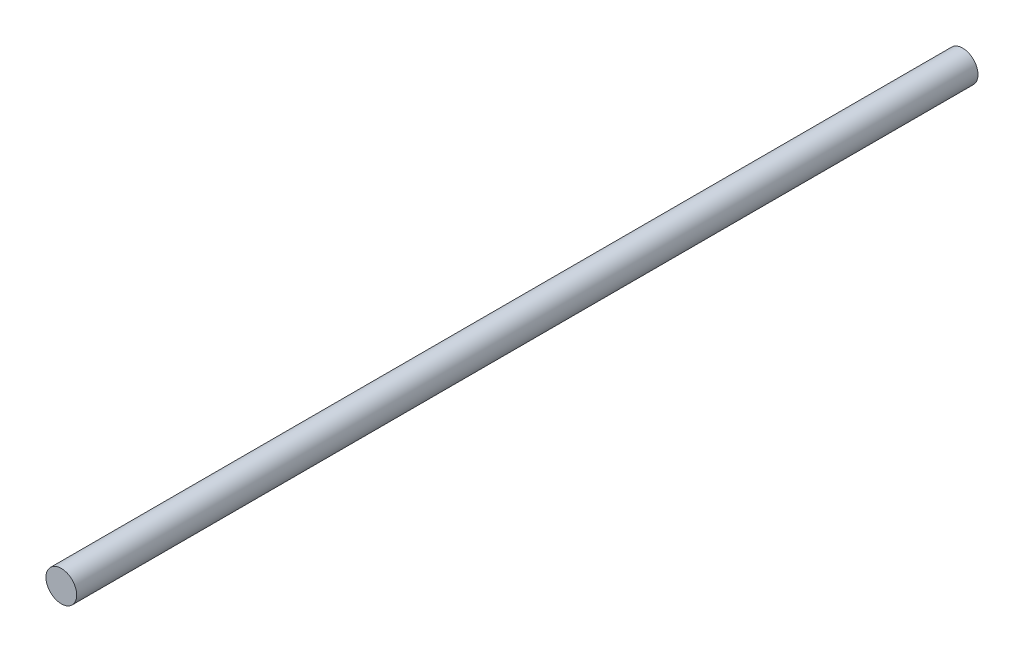
ISO-10303-21;
HEADER;
FILE_DESCRIPTION(('STEP AP214'),'2;1');
FILE_NAME('part.step','',(''),(''),'','','');
FILE_SCHEMA(('AUTOMOTIVE_DESIGN { 1 0 10303 214 1 1 1 1 }'));
ENDSEC;
DATA;
#1=APPLICATION_CONTEXT('core data for automotive mechanical design processes');
#2=APPLICATION_PROTOCOL_DEFINITION('international standard','automotive_design',2000,#1);
#3=PRODUCT_CONTEXT('',#1,'mechanical');
#4=PRODUCT('Part','Part','',(#3));
#5=PRODUCT_RELATED_PRODUCT_CATEGORY('part','',(#4));
#6=PRODUCT_DEFINITION_FORMATION('','',#4);
#7=PRODUCT_DEFINITION_CONTEXT('part definition',#1,'design');
#8=PRODUCT_DEFINITION('design','',#6,#7);
#9=PRODUCT_DEFINITION_SHAPE('','',#8);
#10=(LENGTH_UNIT() NAMED_UNIT(*) SI_UNIT(.MILLI.,.METRE.));
#11=(NAMED_UNIT(*) PLANE_ANGLE_UNIT() SI_UNIT($,.RADIAN.));
#12=(NAMED_UNIT(*) SI_UNIT($,.STERADIAN.) SOLID_ANGLE_UNIT());
#13=UNCERTAINTY_MEASURE_WITH_UNIT(LENGTH_MEASURE(1.E-05),#10,'distance_accuracy_value','');
#14=(GEOMETRIC_REPRESENTATION_CONTEXT(3) GLOBAL_UNCERTAINTY_ASSIGNED_CONTEXT((#13)) GLOBAL_UNIT_ASSIGNED_CONTEXT((#10,
#11,#12)) REPRESENTATION_CONTEXT('',''));
#15=CARTESIAN_POINT('',(0.,0.,0.));
#16=DIRECTION('',(0.,0.,1.));
#17=DIRECTION('',(1.,0.,0.));
#18=AXIS2_PLACEMENT_3D('',#15,#16,#17);
#19=CARTESIAN_POINT('',(0.,0.,88.));
#20=DIRECTION('',(0.,0.,-1.));
#21=DIRECTION('',(-1.,0.,0.));
#22=AXIS2_PLACEMENT_3D('',#19,#20,#21);
#23=CYLINDRICAL_SURFACE('',#22,1.5);
#24=CARTESIAN_POINT('',(0.,0.,88.));
#25=DIRECTION('',(0.,0.,1.));
#26=DIRECTION('',(1.,0.,0.));
#27=AXIS2_PLACEMENT_3D('',#24,#25,#26);
#28=CIRCLE('',#27,1.5);
#29=CARTESIAN_POINT('',(1.5,0.,88.));
#30=VERTEX_POINT('',#29);
#31=EDGE_CURVE('E10',#30,#30,#28,.T.);
#32=ORIENTED_EDGE('',*,*,#31,.F.);
#33=EDGE_LOOP('',(#32));
#34=FACE_BOUND('',#33,.T.);
#35=CARTESIAN_POINT('',(0.,0.,0.));
#36=DIRECTION('',(0.,0.,1.));
#37=DIRECTION('',(1.,0.,0.));
#38=AXIS2_PLACEMENT_3D('',#35,#36,#37);
#39=CIRCLE('',#38,1.5);
#40=CARTESIAN_POINT('',(1.5,0.,0.));
#41=VERTEX_POINT('',#40);
#42=EDGE_CURVE('E38',#41,#41,#39,.T.);
#43=ORIENTED_EDGE('',*,*,#42,.T.);
#44=EDGE_LOOP('',(#43));
#45=FACE_BOUND('',#44,.T.);
#46=ADVANCED_FACE('F35',(#34,#45),#23,.T.);
#47=CARTESIAN_POINT('',(0.,0.,88.));
#48=DIRECTION('',(0.,0.,1.));
#49=DIRECTION('',(1.,0.,0.));
#50=AXIS2_PLACEMENT_3D('',#47,#48,#49);
#51=PLANE('',#50);
#52=ORIENTED_EDGE('',*,*,#31,.T.);
#53=EDGE_LOOP('',(#52));
#54=FACE_BOUND('',#53,.T.);
#55=ADVANCED_FACE('F50',(#54),#51,.T.);
#56=CARTESIAN_POINT('',(0.,0.,0.));
#57=DIRECTION('',(0.,0.,1.));
#58=DIRECTION('',(1.,0.,0.));
#59=AXIS2_PLACEMENT_3D('',#56,#57,#58);
#60=PLANE('',#59);
#61=ORIENTED_EDGE('',*,*,#42,.F.);
#62=EDGE_LOOP('',(#61));
#63=FACE_BOUND('',#62,.T.);
#64=ADVANCED_FACE('F48',(#63),#60,.F.);
#65=CLOSED_SHELL('',(#46,#55,#64));
#66=MANIFOLD_SOLID_BREP('B2',#65);
#67=ADVANCED_BREP_SHAPE_REPRESENTATION('',(#18,#66),#14);
#68=SHAPE_DEFINITION_REPRESENTATION(#9,#67);
ENDSEC;
END-ISO-10303-21;
